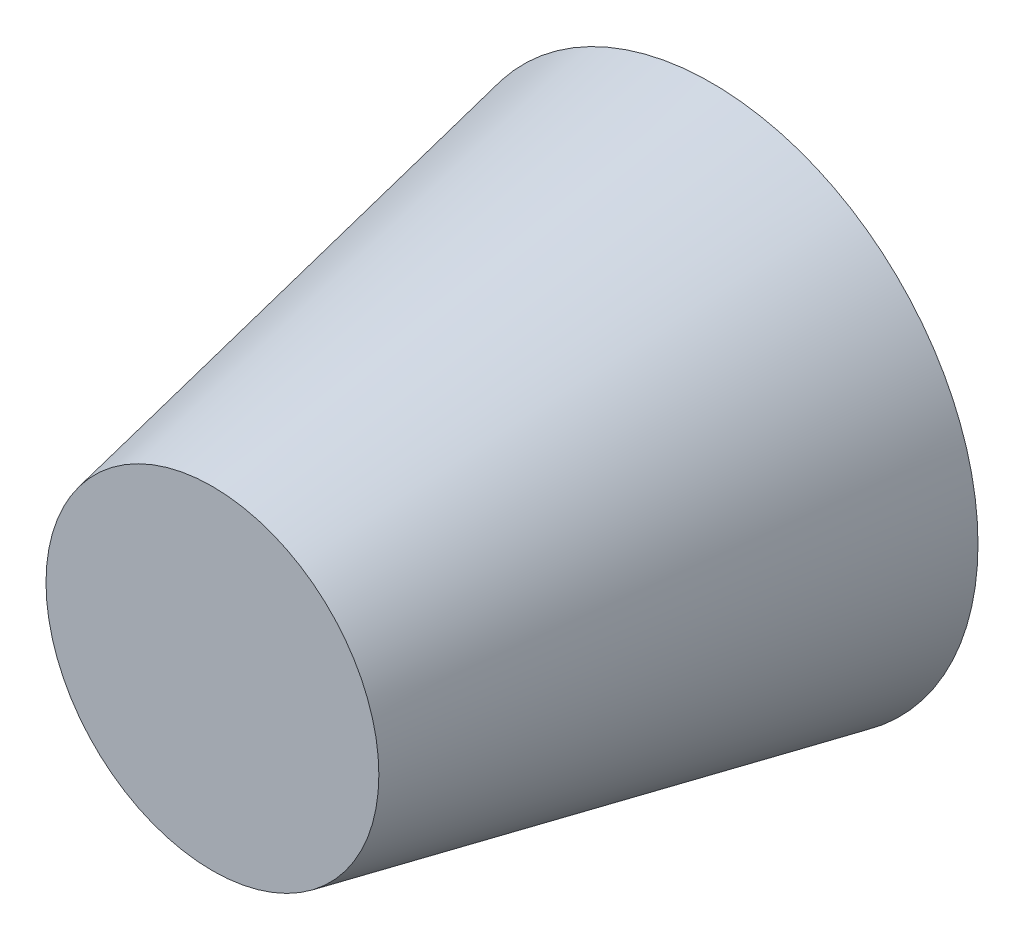
ISO-10303-21;
HEADER;
FILE_DESCRIPTION(('STEP AP214'),'2;1');
FILE_NAME('part.step','',(''),(''),'','','');
FILE_SCHEMA(('AUTOMOTIVE_DESIGN { 1 0 10303 214 1 1 1 1 }'));
ENDSEC;
DATA;
#1=APPLICATION_CONTEXT('core data for automotive mechanical design processes');
#2=APPLICATION_PROTOCOL_DEFINITION('international standard','automotive_design',2000,#1);
#3=PRODUCT_CONTEXT('',#1,'mechanical');
#4=PRODUCT('Part','Part','',(#3));
#5=PRODUCT_RELATED_PRODUCT_CATEGORY('part','',(#4));
#6=PRODUCT_DEFINITION_FORMATION('','',#4);
#7=PRODUCT_DEFINITION_CONTEXT('part definition',#1,'design');
#8=PRODUCT_DEFINITION('design','',#6,#7);
#9=PRODUCT_DEFINITION_SHAPE('','',#8);
#10=(LENGTH_UNIT() NAMED_UNIT(*) SI_UNIT(.MILLI.,.METRE.));
#11=(NAMED_UNIT(*) PLANE_ANGLE_UNIT() SI_UNIT($,.RADIAN.));
#12=(NAMED_UNIT(*) SI_UNIT($,.STERADIAN.) SOLID_ANGLE_UNIT());
#13=UNCERTAINTY_MEASURE_WITH_UNIT(LENGTH_MEASURE(1.E-05),#10,'distance_accuracy_value','');
#14=(GEOMETRIC_REPRESENTATION_CONTEXT(3) GLOBAL_UNCERTAINTY_ASSIGNED_CONTEXT((#13)) GLOBAL_UNIT_ASSIGNED_CONTEXT((#10,
#11,#12)) REPRESENTATION_CONTEXT('',''));
#15=CARTESIAN_POINT('',(0.,0.,0.));
#16=DIRECTION('',(0.,0.,1.));
#17=DIRECTION('',(1.,0.,0.));
#18=AXIS2_PLACEMENT_3D('',#15,#16,#17);
#19=CARTESIAN_POINT('',(0.,0.,15.));
#20=DIRECTION('',(0.,0.,-1.));
#21=DIRECTION('',(-1.,0.,0.));
#22=AXIS2_PLACEMENT_3D('',#19,#20,#21);
#23=CONICAL_SURFACE('',#22,5.,0.197395559849881);
#24=CARTESIAN_POINT('',(0.,0.,15.));
#25=DIRECTION('',(0.,0.,1.));
#26=DIRECTION('',(1.,0.,0.));
#27=AXIS2_PLACEMENT_3D('',#24,#25,#26);
#28=CIRCLE('',#27,5.);
#29=CARTESIAN_POINT('',(5.,0.,15.));
#30=VERTEX_POINT('',#29);
#31=EDGE_CURVE('E11',#30,#30,#28,.F.);
#32=ORIENTED_EDGE('',*,*,#31,.T.);
#33=EDGE_LOOP('',(#32));
#34=FACE_BOUND('',#33,.T.);
#35=CARTESIAN_POINT('',(0.,0.,0.));
#36=DIRECTION('',(0.,0.,1.));
#37=DIRECTION('',(1.,0.,0.));
#38=AXIS2_PLACEMENT_3D('',#35,#36,#37);
#39=CIRCLE('',#38,8.);
#40=CARTESIAN_POINT('',(8.,0.,0.));
#41=VERTEX_POINT('',#40);
#42=EDGE_CURVE('E71',#41,#41,#39,.F.);
#43=ORIENTED_EDGE('',*,*,#42,.F.);
#44=EDGE_LOOP('',(#43));
#45=FACE_BOUND('',#44,.T.);
#46=ADVANCED_FACE('F63',(#34,#45),#23,.T.);
#47=CARTESIAN_POINT('',(0.,0.,15.));
#48=DIRECTION('',(0.,0.,-1.));
#49=DIRECTION('',(-1.,0.,0.));
#50=AXIS2_PLACEMENT_3D('',#47,#48,#49);
#51=PLANE('',#50);
#52=ORIENTED_EDGE('',*,*,#31,.F.);
#53=EDGE_LOOP('',(#52));
#54=FACE_BOUND('',#53,.T.);
#55=ADVANCED_FACE('F102',(#54),#51,.F.);
#56=CARTESIAN_POINT('',(0.,0.,0.));
#57=DIRECTION('',(0.,0.,-1.));
#58=DIRECTION('',(-1.,0.,0.));
#59=AXIS2_PLACEMENT_3D('',#56,#57,#58);
#60=PLANE('',#59);
#61=CARTESIAN_POINT('',(0.,0.,0.));
#62=DIRECTION('',(0.,0.,-1.));
#63=DIRECTION('',(-1.,0.,0.));
#64=AXIS2_PLACEMENT_3D('',#61,#62,#63);
#65=CIRCLE('',#64,2.9);
#66=CARTESIAN_POINT('',(-2.9,0.,0.));
#67=VERTEX_POINT('',#66);
#68=EDGE_CURVE('E148',#67,#67,#65,.T.);
#69=ORIENTED_EDGE('',*,*,#68,.F.);
#70=EDGE_LOOP('',(#69));
#71=FACE_BOUND('',#70,.T.);
#72=ORIENTED_EDGE('',*,*,#42,.T.);
#73=EDGE_LOOP('',(#72));
#74=FACE_BOUND('',#73,.T.);
#75=ADVANCED_FACE('F93',(#71,#74),#60,.T.);
#76=CARTESIAN_POINT('',(0.,0.,6.));
#77=DIRECTION('',(0.,0.,-1.));
#78=DIRECTION('',(-1.,0.,0.));
#79=AXIS2_PLACEMENT_3D('',#76,#77,#78);
#80=CYLINDRICAL_SURFACE('',#79,2.9);
#81=CARTESIAN_POINT('',(0.,0.,6.));
#82=DIRECTION('',(0.,0.,-1.));
#83=DIRECTION('',(-1.,0.,0.));
#84=AXIS2_PLACEMENT_3D('',#81,#82,#83);
#85=CIRCLE('',#84,2.9);
#86=CARTESIAN_POINT('',(-2.9,0.,6.));
#87=VERTEX_POINT('',#86);
#88=EDGE_CURVE('E77',#87,#87,#85,.T.);
#89=ORIENTED_EDGE('',*,*,#88,.F.);
#90=EDGE_LOOP('',(#89));
#91=FACE_BOUND('',#90,.T.);
#92=ORIENTED_EDGE('',*,*,#68,.T.);
#93=EDGE_LOOP('',(#92));
#94=FACE_BOUND('',#93,.T.);
#95=ADVANCED_FACE('F101',(#91,#94),#80,.F.);
#96=CARTESIAN_POINT('',(0.,0.,6.));
#97=DIRECTION('',(0.,0.,-1.));
#98=DIRECTION('',(-1.,0.,0.));
#99=AXIS2_PLACEMENT_3D('',#96,#97,#98);
#100=PLANE('',#99);
#101=ORIENTED_EDGE('',*,*,#88,.T.);
#102=EDGE_LOOP('',(#101));
#103=FACE_BOUND('',#102,.T.);
#104=ADVANCED_FACE('F110',(#103),#100,.T.);
#105=CLOSED_SHELL('',(#46,#55,#75,#95,#104));
#106=MANIFOLD_SOLID_BREP('B2',#105);
#107=ADVANCED_BREP_SHAPE_REPRESENTATION('',(#18,#106),#14);
#108=SHAPE_DEFINITION_REPRESENTATION(#9,#107);
ENDSEC;
END-ISO-10303-21;
